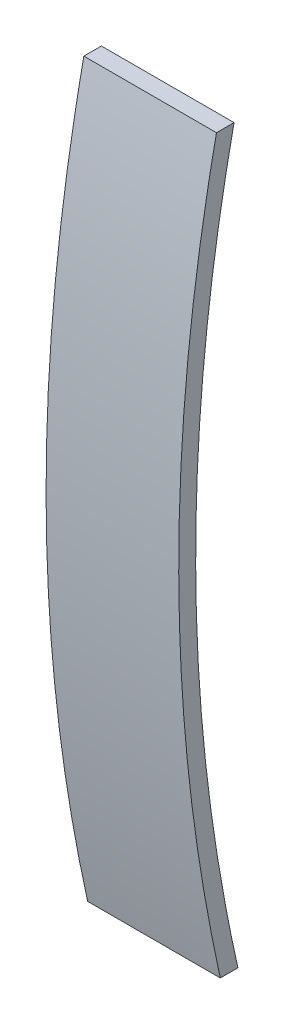
ISO-10303-21;
HEADER;
FILE_DESCRIPTION(('STEP AP214'),'2;1');
FILE_NAME('part.step','',(''),(''),'','','');
FILE_SCHEMA(('AUTOMOTIVE_DESIGN { 1 0 10303 214 1 1 1 1 }'));
ENDSEC;
DATA;
#1=APPLICATION_CONTEXT('core data for automotive mechanical design processes');
#2=APPLICATION_PROTOCOL_DEFINITION('international standard','automotive_design',2000,#1);
#3=PRODUCT_CONTEXT('',#1,'mechanical');
#4=PRODUCT('Part','Part','',(#3));
#5=PRODUCT_RELATED_PRODUCT_CATEGORY('part','',(#4));
#6=PRODUCT_DEFINITION_FORMATION('','',#4);
#7=PRODUCT_DEFINITION_CONTEXT('part definition',#1,'design');
#8=PRODUCT_DEFINITION('design','',#6,#7);
#9=PRODUCT_DEFINITION_SHAPE('','',#8);
#10=(LENGTH_UNIT() NAMED_UNIT(*) SI_UNIT(.MILLI.,.METRE.));
#11=(NAMED_UNIT(*) PLANE_ANGLE_UNIT() SI_UNIT($,.RADIAN.));
#12=(NAMED_UNIT(*) SI_UNIT($,.STERADIAN.) SOLID_ANGLE_UNIT());
#13=UNCERTAINTY_MEASURE_WITH_UNIT(LENGTH_MEASURE(1.E-05),#10,'distance_accuracy_value','');
#14=(GEOMETRIC_REPRESENTATION_CONTEXT(3) GLOBAL_UNCERTAINTY_ASSIGNED_CONTEXT((#13)) GLOBAL_UNIT_ASSIGNED_CONTEXT((#10,
#11,#12)) REPRESENTATION_CONTEXT('',''));
#15=CARTESIAN_POINT('',(0.,0.,0.));
#16=DIRECTION('',(0.,0.,1.));
#17=DIRECTION('',(1.,0.,0.));
#18=AXIS2_PLACEMENT_3D('',#15,#16,#17);
#19=CARTESIAN_POINT('',(0.,2108.2,254.));
#20=DIRECTION('',(1.,0.,0.));
#21=DIRECTION('',(0.,0.,-1.));
#22=AXIS2_PLACEMENT_3D('',#19,#20,#21);
#23=PLANE('',#22);
#24=CARTESIAN_POINT('',(0.,-1.66533453693773E-13,50.5763340736483));
#25=CARTESIAN_POINT('',(0.,162.415354185742,86.5280705743853));
#26=CARTESIAN_POINT('',(0.,325.911171885657,114.606351627726));
#27=CARTESIAN_POINT('',(0.,583.578560023147,145.724683165672));
#28=CARTESIAN_POINT('',(0.,676.984692022694,154.342567015762));
#29=CARTESIAN_POINT('',(0.,794.202282187365,161.763396996546));
#30=CARTESIAN_POINT('',(0.,829.402056055766,163.738263909008));
#31=CARTESIAN_POINT('',(0.,864.653881246188,165.333827161949));
#32=CARTESIAN_POINT('',(0.,888.166699325149,166.312996165849));
#33=CARTESIAN_POINT('',(0.,899.926998718854,166.760214295947));
#34=CARTESIAN_POINT('',(0.,958.712785523353,168.78309537024));
#35=CARTESIAN_POINT('',(0.,1005.72348635274,169.720514345302));
#36=CARTESIAN_POINT('',(0.,1146.70192579219,170.494777037851));
#37=CARTESIAN_POINT('',(0.,1240.61600150808,168.293632390847));
#38=CARTESIAN_POINT('',(0.,1381.38027759742,160.934483303879));
#39=CARTESIAN_POINT('',(0.,1440.00980144364,157.02287098901));
#40=CARTESIAN_POINT('',(0.,1498.61156619715,152.057034729562));
#41=CARTESIAN_POINT('',(0.,1522.0500526301,149.986410122988));
#42=CARTESIAN_POINT('',(0.,1533.7699596783,148.908777339105));
#43=CARTESIAN_POINT('',(0.,1568.9082367444,145.551282695547));
#44=CARTESIAN_POINT('',(0.,1592.30742590005,143.14668440261));
#45=CARTESIAN_POINT('',(0.,1781.14392484236,122.385028935293));
#46=CARTESIAN_POINT('',(0.,1945.29723594847,95.9194420516107));
#47=CARTESIAN_POINT('',(0.,2108.2,61.5565745097099));
#48=B_SPLINE_CURVE_WITH_KNOTS('',3,(#24,#25,#26,#27,#28,#29,#30,#31,#32,#33,#34,#35,#36,#37,#38,
#39,#40,#41,#42,#43,#44,#45,#46,#47),.UNSPECIFIED.,.F.,.F.,(4,2,2,1,2,2,2,2,1,2,2,2,4),
(0.0288466420129751,0.250000000000003,0.375000000000004,0.406250000000004,0.421875000000004,
0.437500000000005,0.500000000000004,0.625000000000004,0.687500000000003,0.703125000000003,
0.718750000000003,0.750000000000003,0.971226416955381),.UNSPECIFIED.);
#49=CARTESIAN_POINT('',(0.,0.,50.5763340736483));
#50=VERTEX_POINT('',#49);
#51=CARTESIAN_POINT('',(0.,2108.2,61.5565745097099));
#52=VERTEX_POINT('',#51);
#53=EDGE_CURVE('E109',#50,#52,#48,.T.);
#54=ORIENTED_EDGE('',*,*,#53,.T.);
#55=DIRECTION('',(0.,0.,-1.));
#56=VECTOR('',#55,1.);
#57=CARTESIAN_POINT('',(0.,2108.2,254.));
#58=LINE('',#57,#56);
#59=CARTESIAN_POINT('',(0.,2108.2,11.1504383671369));
#60=VERTEX_POINT('',#59);
#61=EDGE_CURVE('E126',#52,#60,#58,.T.);
#62=ORIENTED_EDGE('',*,*,#61,.T.);
#63=CARTESIAN_POINT('',(0.,2108.2,11.1504383671369));
#64=CARTESIAN_POINT('',(0.,1945.37215804599,46.0305241588976));
#65=CARTESIAN_POINT('',(0.,1781.14220218214,72.9367636161349));
#66=CARTESIAN_POINT('',(0.,1603.72908738496,92.7410279249587));
#67=CARTESIAN_POINT('',(0.,1592.01604136105,94.0057168611817));
#68=CARTESIAN_POINT('',(0.,1568.58991180398,96.4493427749216));
#69=CARTESIAN_POINT('',(0.,1533.44560999247,99.9867422223474));
#70=CARTESIAN_POINT('',(0.,1451.40645434215,107.343585427034));
#71=CARTESIAN_POINT('',(0.,1381.02572169495,112.10879983064));
#72=CARTESIAN_POINT('',(0.,1240.18201965033,119.577633775436));
#73=CARTESIAN_POINT('',(0.,1146.17656872949,121.808049280976));
#74=CARTESIAN_POINT('',(0.,1028.53171799234,121.135613978903));
#75=CARTESIAN_POINT('',(0.,993.227910054428,120.674350908835));
#76=CARTESIAN_POINT('',(0.,957.908545813135,119.823106534271));
#77=CARTESIAN_POINT('',(0.,934.358843012326,119.168872139903));
#78=CARTESIAN_POINT('',(0.,922.586879755592,118.798502769584));
#79=CARTESIAN_POINT('',(0.,863.76473108062,116.731703036885));
#80=CARTESIAN_POINT('',(0.,816.804237017485,114.38978958396));
#81=CARTESIAN_POINT('',(0.,676.210830806109,105.324111183215));
#82=CARTESIAN_POINT('',(0.,582.865974305705,96.5605521565677));
#83=CARTESIAN_POINT('',(0.,325.4413057181,64.9476930138439));
#84=CARTESIAN_POINT('',(0.,162.159053025692,36.450675370894));
#85=CARTESIAN_POINT('',(0.,0.,0.));
#86=B_SPLINE_CURVE_WITH_KNOTS('',3,(#63,#64,#65,#66,#67,#68,#69,#70,#71,#72,#73,#74,#75,#76,#77,
#78,#79,#80,#81,#82,#83,#84,#85),.UNSPECIFIED.,.F.,.F.,(4,2,2,1,1,2,2,1,2,2,2,2,4),
(0.0287883987424428,0.25,0.265625,0.28125,0.3125,0.375,0.5,0.53125,0.546875,0.5625,0.625,0.75,
0.971112085429335),.UNSPECIFIED.);
#87=CARTESIAN_POINT('',(0.,0.,0.));
#88=VERTEX_POINT('',#87);
#89=EDGE_CURVE('E90',#60,#88,#86,.T.);
#90=ORIENTED_EDGE('',*,*,#89,.T.);
#91=DIRECTION('',(0.,0.,-1.));
#92=VECTOR('',#91,1.);
#93=CARTESIAN_POINT('',(0.,0.,254.));
#94=LINE('',#93,#92);
#95=EDGE_CURVE('E12',#50,#88,#94,.T.);
#96=ORIENTED_EDGE('',*,*,#95,.F.);
#97=EDGE_LOOP('',(#54,#62,#90,#96));
#98=FACE_BOUND('',#97,.T.);
#99=ADVANCED_FACE('F68',(#98),#23,.F.);
#100=CARTESIAN_POINT('',(0.,0.,254.));
#101=DIRECTION('',(0.,1.,0.));
#102=DIRECTION('',(0.,0.,1.));
#103=AXIS2_PLACEMENT_3D('',#100,#101,#102);
#104=PLANE('',#103);
#105=DIRECTION('',(-1.,0.,0.));
#106=VECTOR('',#105,1.);
#107=CARTESIAN_POINT('',(381.,0.,50.5763340736483));
#108=LINE('',#107,#106);
#109=CARTESIAN_POINT('',(381.,0.,50.5763340736483));
#110=VERTEX_POINT('',#109);
#111=EDGE_CURVE('E106',#110,#50,#108,.T.);
#112=ORIENTED_EDGE('',*,*,#111,.T.);
#113=ORIENTED_EDGE('',*,*,#95,.T.);
#114=DIRECTION('',(-1.,0.,0.));
#115=VECTOR('',#114,1.);
#116=CARTESIAN_POINT('',(381.,0.,0.));
#117=LINE('',#116,#115);
#118=CARTESIAN_POINT('',(381.,0.,0.));
#119=VERTEX_POINT('',#118);
#120=EDGE_CURVE('E125',#119,#88,#117,.T.);
#121=ORIENTED_EDGE('',*,*,#120,.F.);
#122=DIRECTION('',(0.,0.,-1.));
#123=VECTOR('',#122,1.);
#124=CARTESIAN_POINT('',(381.,0.,254.));
#125=LINE('',#124,#123);
#126=EDGE_CURVE('E75',#110,#119,#125,.T.);
#127=ORIENTED_EDGE('',*,*,#126,.F.);
#128=EDGE_LOOP('',(#112,#113,#121,#127));
#129=FACE_BOUND('',#128,.T.);
#130=ADVANCED_FACE('F124',(#129),#104,.F.);
#131=CARTESIAN_POINT('',(381.,0.,254.));
#132=DIRECTION('',(-1.,0.,0.));
#133=DIRECTION('',(0.,0.,1.));
#134=AXIS2_PLACEMENT_3D('',#131,#132,#133);
#135=PLANE('',#134);
#136=CARTESIAN_POINT('',(381.,-1.66533453693773E-13,50.5763340736483));
#137=CARTESIAN_POINT('',(381.,162.415354185742,86.5280705743853));
#138=CARTESIAN_POINT('',(381.,325.911171885657,114.606351627726));
#139=CARTESIAN_POINT('',(381.,583.578560023147,145.724683165672));
#140=CARTESIAN_POINT('',(381.,676.984692022694,154.342567015762));
#141=CARTESIAN_POINT('',(381.,794.202282187365,161.763396996546));
#142=CARTESIAN_POINT('',(381.,829.402056055766,163.738263909008));
#143=CARTESIAN_POINT('',(381.,864.653881246188,165.333827161949));
#144=CARTESIAN_POINT('',(381.,888.166699325149,166.312996165849));
#145=CARTESIAN_POINT('',(381.,899.926998718854,166.760214295947));
#146=CARTESIAN_POINT('',(381.,958.712785523353,168.78309537024));
#147=CARTESIAN_POINT('',(381.,1005.72348635274,169.720514345302));
#148=CARTESIAN_POINT('',(381.,1146.70192579219,170.494777037851));
#149=CARTESIAN_POINT('',(381.,1240.61600150808,168.293632390847));
#150=CARTESIAN_POINT('',(381.,1381.38027759742,160.934483303879));
#151=CARTESIAN_POINT('',(381.,1440.00980144364,157.02287098901));
#152=CARTESIAN_POINT('',(381.,1498.61156619715,152.057034729562));
#153=CARTESIAN_POINT('',(381.,1522.0500526301,149.986410122988));
#154=CARTESIAN_POINT('',(381.,1533.7699596783,148.908777339105));
#155=CARTESIAN_POINT('',(381.,1568.9082367444,145.551282695547));
#156=CARTESIAN_POINT('',(381.,1592.30742590005,143.14668440261));
#157=CARTESIAN_POINT('',(381.,1781.14392484236,122.385028935293));
#158=CARTESIAN_POINT('',(381.,1945.29723594847,95.9194420516107));
#159=CARTESIAN_POINT('',(381.,2108.2,61.5565745097099));
#160=B_SPLINE_CURVE_WITH_KNOTS('',3,(#136,#137,#138,#139,#140,#141,#142,#143,#144,#145,#146,
#147,#148,#149,#150,#151,#152,#153,#154,#155,#156,#157,#158,#159),.UNSPECIFIED.,.F.,.F.,(4,2,2,
1,2,2,2,2,1,2,2,2,4),(0.0288466420129751,0.250000000000003,0.375000000000004,0.406250000000004,
0.421875000000004,0.437500000000005,0.500000000000004,0.625000000000004,0.687500000000003,
0.703125000000003,0.718750000000003,0.750000000000003,0.971226416955381),.UNSPECIFIED.);
#161=CARTESIAN_POINT('',(381.,2108.2,61.5565745097099));
#162=VERTEX_POINT('',#161);
#163=EDGE_CURVE('E82',#110,#162,#160,.T.);
#164=ORIENTED_EDGE('',*,*,#163,.F.);
#165=ORIENTED_EDGE('',*,*,#126,.T.);
#166=CARTESIAN_POINT('',(381.,2108.2,11.1504383671369));
#167=CARTESIAN_POINT('',(381.,1945.37215804599,46.0305241588976));
#168=CARTESIAN_POINT('',(381.,1781.14220218214,72.9367636161349));
#169=CARTESIAN_POINT('',(381.,1603.72908738496,92.7410279249587));
#170=CARTESIAN_POINT('',(381.,1592.01604136105,94.0057168611817));
#171=CARTESIAN_POINT('',(381.,1568.58991180398,96.4493427749216));
#172=CARTESIAN_POINT('',(381.,1533.44560999247,99.9867422223474));
#173=CARTESIAN_POINT('',(381.,1451.40645434215,107.343585427034));
#174=CARTESIAN_POINT('',(381.,1381.02572169495,112.10879983064));
#175=CARTESIAN_POINT('',(381.,1240.18201965033,119.577633775436));
#176=CARTESIAN_POINT('',(381.,1146.17656872949,121.808049280976));
#177=CARTESIAN_POINT('',(381.,1028.53171799234,121.135613978903));
#178=CARTESIAN_POINT('',(381.,993.227910054428,120.674350908835));
#179=CARTESIAN_POINT('',(381.,957.908545813135,119.823106534271));
#180=CARTESIAN_POINT('',(381.,934.358843012326,119.168872139903));
#181=CARTESIAN_POINT('',(381.,922.586879755592,118.798502769584));
#182=CARTESIAN_POINT('',(381.,863.76473108062,116.731703036885));
#183=CARTESIAN_POINT('',(381.,816.804237017485,114.38978958396));
#184=CARTESIAN_POINT('',(381.,676.210830806109,105.324111183215));
#185=CARTESIAN_POINT('',(381.,582.865974305705,96.5605521565677));
#186=CARTESIAN_POINT('',(381.,325.4413057181,64.9476930138439));
#187=CARTESIAN_POINT('',(381.,162.159053025692,36.450675370894));
#188=CARTESIAN_POINT('',(381.,0.,0.));
#189=B_SPLINE_CURVE_WITH_KNOTS('',3,(#166,#167,#168,#169,#170,#171,#172,#173,#174,#175,#176,
#177,#178,#179,#180,#181,#182,#183,#184,#185,#186,#187,#188),.UNSPECIFIED.,.F.,.F.,(4,2,2,1,1,2,
2,1,2,2,2,2,4),(0.0287883987424428,0.25,0.265625,0.28125,0.3125,0.375,0.5,0.53125,0.546875,
0.5625,0.625,0.75,0.971112085429335),.UNSPECIFIED.);
#190=CARTESIAN_POINT('',(381.,2108.2,11.1504383671369));
#191=VERTEX_POINT('',#190);
#192=EDGE_CURVE('E134',#191,#119,#189,.T.);
#193=ORIENTED_EDGE('',*,*,#192,.F.);
#194=DIRECTION('',(0.,0.,-1.));
#195=VECTOR('',#194,1.);
#196=CARTESIAN_POINT('',(381.,2108.2,254.));
#197=LINE('',#196,#195);
#198=EDGE_CURVE('E121',#162,#191,#197,.T.);
#199=ORIENTED_EDGE('',*,*,#198,.F.);
#200=EDGE_LOOP('',(#164,#165,#193,#199));
#201=FACE_BOUND('',#200,.T.);
#202=ADVANCED_FACE('F118',(#201),#135,.F.);
#203=CARTESIAN_POINT('',(381.,2108.2,254.));
#204=DIRECTION('',(0.,-1.,0.));
#205=DIRECTION('',(0.,0.,-1.));
#206=AXIS2_PLACEMENT_3D('',#203,#204,#205);
#207=PLANE('',#206);
#208=DIRECTION('',(-1.,0.,0.));
#209=VECTOR('',#208,1.);
#210=CARTESIAN_POINT('',(381.,2108.2,61.5565745097099));
#211=LINE('',#210,#209);
#212=EDGE_CURVE('E113',#162,#52,#211,.T.);
#213=ORIENTED_EDGE('',*,*,#212,.F.);
#214=ORIENTED_EDGE('',*,*,#198,.T.);
#215=DIRECTION('',(-1.,0.,0.));
#216=VECTOR('',#215,1.);
#217=CARTESIAN_POINT('',(381.,2108.2,11.1504383671369));
#218=LINE('',#217,#216);
#219=EDGE_CURVE('E131',#191,#60,#218,.T.);
#220=ORIENTED_EDGE('',*,*,#219,.T.);
#221=ORIENTED_EDGE('',*,*,#61,.F.);
#222=EDGE_LOOP('',(#213,#214,#220,#221));
#223=FACE_BOUND('',#222,.T.);
#224=ADVANCED_FACE('F153',(#223),#207,.F.);
#225=DIRECTION('',(-1.,0.,0.));
#226=VECTOR('',#225,1.);
#227=SURFACE_OF_LINEAR_EXTRUSION('',#189,#226);
#228=ORIENTED_EDGE('',*,*,#89,.F.);
#229=ORIENTED_EDGE('',*,*,#219,.F.);
#230=ORIENTED_EDGE('',*,*,#192,.T.);
#231=ORIENTED_EDGE('',*,*,#120,.T.);
#232=EDGE_LOOP('',(#228,#229,#230,#231));
#233=FACE_BOUND('',#232,.T.);
#234=ADVANCED_FACE('F149',(#233),#227,.T.);
#235=DIRECTION('',(-1.,0.,0.));
#236=VECTOR('',#235,1.);
#237=SURFACE_OF_LINEAR_EXTRUSION('',#160,#236);
#238=ORIENTED_EDGE('',*,*,#53,.F.);
#239=ORIENTED_EDGE('',*,*,#111,.F.);
#240=ORIENTED_EDGE('',*,*,#163,.T.);
#241=ORIENTED_EDGE('',*,*,#212,.T.);
#242=EDGE_LOOP('',(#238,#239,#240,#241));
#243=FACE_BOUND('',#242,.T.);
#244=ADVANCED_FACE('F107',(#243),#237,.T.);
#245=CLOSED_SHELL('',(#99,#130,#202,#224,#234,#244));
#246=MANIFOLD_SOLID_BREP('B2',#245);
#247=ADVANCED_BREP_SHAPE_REPRESENTATION('',(#18,#246),#14);
#248=SHAPE_DEFINITION_REPRESENTATION(#9,#247);
ENDSEC;
END-ISO-10303-21;
